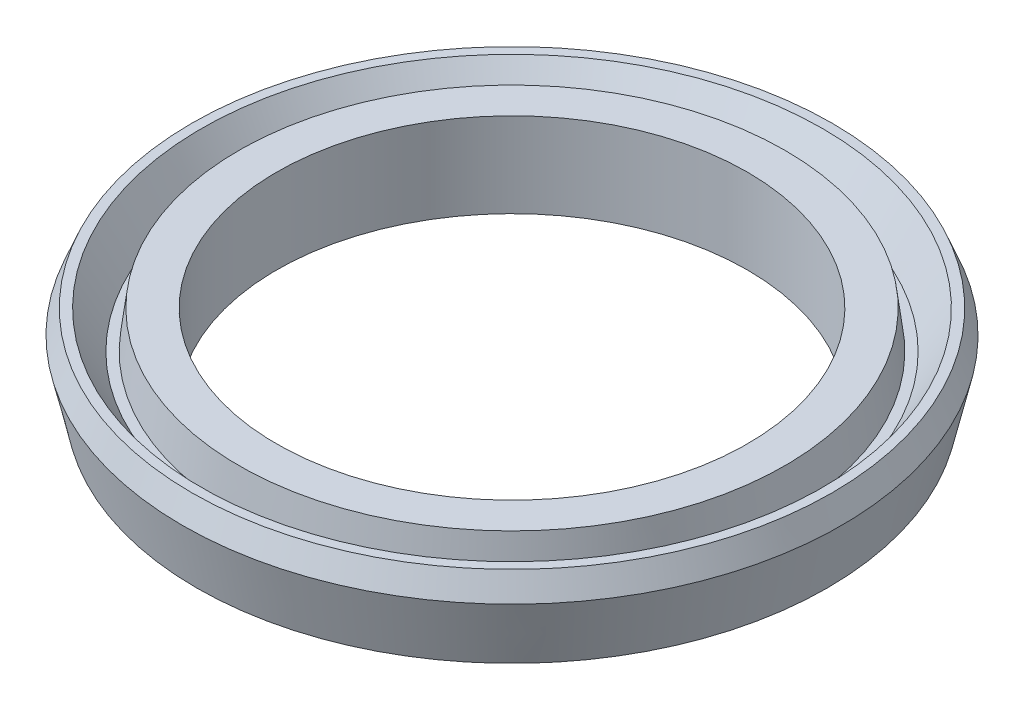
ISO-10303-21;
HEADER;
FILE_DESCRIPTION(('STEP AP214'),'2;1');
FILE_NAME('part.step','',(''),(''),'','','');
FILE_SCHEMA(('AUTOMOTIVE_DESIGN { 1 0 10303 214 1 1 1 1 }'));
ENDSEC;
DATA;
#1=APPLICATION_CONTEXT('core data for automotive mechanical design processes');
#2=APPLICATION_PROTOCOL_DEFINITION('international standard','automotive_design',2000,#1);
#3=PRODUCT_CONTEXT('',#1,'mechanical');
#4=PRODUCT('Part','Part','',(#3));
#5=PRODUCT_RELATED_PRODUCT_CATEGORY('part','',(#4));
#6=PRODUCT_DEFINITION_FORMATION('','',#4);
#7=PRODUCT_DEFINITION_CONTEXT('part definition',#1,'design');
#8=PRODUCT_DEFINITION('design','',#6,#7);
#9=PRODUCT_DEFINITION_SHAPE('','',#8);
#10=(LENGTH_UNIT() NAMED_UNIT(*) SI_UNIT(.MILLI.,.METRE.));
#11=(NAMED_UNIT(*) PLANE_ANGLE_UNIT() SI_UNIT($,.RADIAN.));
#12=(NAMED_UNIT(*) SI_UNIT($,.STERADIAN.) SOLID_ANGLE_UNIT());
#13=UNCERTAINTY_MEASURE_WITH_UNIT(LENGTH_MEASURE(1.E-05),#10,'distance_accuracy_value','');
#14=(GEOMETRIC_REPRESENTATION_CONTEXT(3) GLOBAL_UNCERTAINTY_ASSIGNED_CONTEXT((#13)) GLOBAL_UNIT_ASSIGNED_CONTEXT((#10,
#11,#12)) REPRESENTATION_CONTEXT('',''));
#15=CARTESIAN_POINT('',(0.,0.,0.));
#16=DIRECTION('',(0.,0.,1.));
#17=DIRECTION('',(1.,0.,0.));
#18=AXIS2_PLACEMENT_3D('',#15,#16,#17);
#19=CARTESIAN_POINT('',(6.7,0.,0.));
#20=DIRECTION('',(0.,-1.,0.));
#21=DIRECTION('',(0.,0.,-1.));
#22=AXIS2_PLACEMENT_3D('',#19,#20,#21);
#23=PLANE('',#22);
#24=CARTESIAN_POINT('',(0.,0.,0.));
#25=DIRECTION('',(0.,-1.,0.));
#26=DIRECTION('',(0.,0.,-1.));
#27=AXIS2_PLACEMENT_3D('',#24,#25,#26);
#28=CIRCLE('',#27,6.7);
#29=CARTESIAN_POINT('',(0.,0.,-6.7));
#30=VERTEX_POINT('',#29);
#31=EDGE_CURVE('E63',#30,#30,#28,.T.);
#32=ORIENTED_EDGE('',*,*,#31,.T.);
#33=EDGE_LOOP('',(#32));
#34=FACE_BOUND('',#33,.T.);
#35=CARTESIAN_POINT('',(0.,0.,0.));
#36=DIRECTION('',(0.,-1.,0.));
#37=DIRECTION('',(0.,0.,-1.));
#38=AXIS2_PLACEMENT_3D('',#35,#36,#37);
#39=CIRCLE('',#38,5.);
#40=CARTESIAN_POINT('',(0.,0.,-5.));
#41=VERTEX_POINT('',#40);
#42=EDGE_CURVE('E10',#41,#41,#39,.T.);
#43=ORIENTED_EDGE('',*,*,#42,.F.);
#44=EDGE_LOOP('',(#43));
#45=FACE_BOUND('',#44,.T.);
#46=ADVANCED_FACE('F32',(#34,#45),#23,.T.);
#47=CARTESIAN_POINT('',(0.,0.,0.));
#48=DIRECTION('',(0.,-1.,0.));
#49=DIRECTION('',(0.,0.,-1.));
#50=AXIS2_PLACEMENT_3D('',#47,#48,#49);
#51=CYLINDRICAL_SURFACE('',#50,5.);
#52=ORIENTED_EDGE('',*,*,#42,.T.);
#53=EDGE_LOOP('',(#52));
#54=FACE_BOUND('',#53,.T.);
#55=CARTESIAN_POINT('',(0.,1.8,0.));
#56=DIRECTION('',(0.,-1.,0.));
#57=DIRECTION('',(0.,0.,-1.));
#58=AXIS2_PLACEMENT_3D('',#55,#56,#57);
#59=CIRCLE('',#58,5.);
#60=CARTESIAN_POINT('',(0.,1.8,-5.));
#61=VERTEX_POINT('',#60);
#62=EDGE_CURVE('E38',#61,#61,#59,.T.);
#63=ORIENTED_EDGE('',*,*,#62,.F.);
#64=EDGE_LOOP('',(#63));
#65=FACE_BOUND('',#64,.T.);
#66=ADVANCED_FACE('F81',(#54,#65),#51,.F.);
#67=CARTESIAN_POINT('',(5.,1.8,0.));
#68=DIRECTION('',(0.,1.,0.));
#69=DIRECTION('',(0.,0.,1.));
#70=AXIS2_PLACEMENT_3D('',#67,#68,#69);
#71=PLANE('',#70);
#72=ORIENTED_EDGE('',*,*,#62,.T.);
#73=EDGE_LOOP('',(#72));
#74=FACE_BOUND('',#73,.T.);
#75=CARTESIAN_POINT('',(0.,1.8,0.));
#76=DIRECTION('',(0.,-1.,0.));
#77=DIRECTION('',(0.,0.,-1.));
#78=AXIS2_PLACEMENT_3D('',#75,#76,#77);
#79=CIRCLE('',#78,5.8);
#80=CARTESIAN_POINT('',(0.,1.8,-5.8));
#81=VERTEX_POINT('',#80);
#82=EDGE_CURVE('E42',#81,#81,#79,.T.);
#83=ORIENTED_EDGE('',*,*,#82,.F.);
#84=EDGE_LOOP('',(#83));
#85=FACE_BOUND('',#84,.T.);
#86=ADVANCED_FACE('F85',(#74,#85),#71,.T.);
#87=CARTESIAN_POINT('',(0.,1.,0.));
#88=DIRECTION('',(0.,-1.,0.));
#89=DIRECTION('',(0.,0.,-1.));
#90=AXIS2_PLACEMENT_3D('',#87,#88,#89);
#91=CONICAL_SURFACE('',#90,5.9,0.124354994546762);
#92=ORIENTED_EDGE('',*,*,#82,.T.);
#93=EDGE_LOOP('',(#92));
#94=FACE_BOUND('',#93,.T.);
#95=CARTESIAN_POINT('',(0.,1.,0.));
#96=DIRECTION('',(0.,-1.,0.));
#97=DIRECTION('',(0.,0.,-1.));
#98=AXIS2_PLACEMENT_3D('',#95,#96,#97);
#99=CIRCLE('',#98,5.9);
#100=CARTESIAN_POINT('',(0.,1.,-5.9));
#101=VERTEX_POINT('',#100);
#102=EDGE_CURVE('E46',#101,#101,#99,.T.);
#103=ORIENTED_EDGE('',*,*,#102,.F.);
#104=EDGE_LOOP('',(#103));
#105=FACE_BOUND('',#104,.T.);
#106=ADVANCED_FACE('F89',(#94,#105),#91,.T.);
#107=CARTESIAN_POINT('',(5.9,1.,0.));
#108=DIRECTION('',(0.,1.,0.));
#109=DIRECTION('',(0.,0.,1.));
#110=AXIS2_PLACEMENT_3D('',#107,#108,#109);
#111=PLANE('',#110);
#112=ORIENTED_EDGE('',*,*,#102,.T.);
#113=EDGE_LOOP('',(#112));
#114=FACE_BOUND('',#113,.T.);
#115=CARTESIAN_POINT('',(0.,0.999999999999999,0.));
#116=DIRECTION('',(0.,-1.,0.));
#117=DIRECTION('',(0.,0.,-1.));
#118=AXIS2_PLACEMENT_3D('',#115,#116,#117);
#119=CIRCLE('',#118,6.1);
#120=CARTESIAN_POINT('',(0.,0.999999999999999,-6.1));
#121=VERTEX_POINT('',#120);
#122=EDGE_CURVE('E51',#121,#121,#119,.T.);
#123=ORIENTED_EDGE('',*,*,#122,.F.);
#124=EDGE_LOOP('',(#123));
#125=FACE_BOUND('',#124,.T.);
#126=ADVANCED_FACE('F95',(#114,#125),#111,.T.);
#127=CARTESIAN_POINT('',(0.,1.8,0.));
#128=DIRECTION('',(0.,1.,0.));
#129=DIRECTION('',(0.,0.,1.));
#130=AXIS2_PLACEMENT_3D('',#127,#128,#129);
#131=CONICAL_SURFACE('',#130,6.6,0.558599315343562);
#132=ORIENTED_EDGE('',*,*,#122,.T.);
#133=EDGE_LOOP('',(#132));
#134=FACE_BOUND('',#133,.T.);
#135=CARTESIAN_POINT('',(0.,1.8,0.));
#136=DIRECTION('',(0.,-1.,0.));
#137=DIRECTION('',(0.,0.,-1.));
#138=AXIS2_PLACEMENT_3D('',#135,#136,#137);
#139=CIRCLE('',#138,6.6);
#140=CARTESIAN_POINT('',(0.,1.8,-6.6));
#141=VERTEX_POINT('',#140);
#142=EDGE_CURVE('E54',#141,#141,#139,.T.);
#143=ORIENTED_EDGE('',*,*,#142,.F.);
#144=EDGE_LOOP('',(#143));
#145=FACE_BOUND('',#144,.T.);
#146=ADVANCED_FACE('F99',(#134,#145),#131,.F.);
#147=CARTESIAN_POINT('',(6.6,1.8,0.));
#148=DIRECTION('',(0.,1.,0.));
#149=DIRECTION('',(0.,0.,1.));
#150=AXIS2_PLACEMENT_3D('',#147,#148,#149);
#151=PLANE('',#150);
#152=ORIENTED_EDGE('',*,*,#142,.T.);
#153=EDGE_LOOP('',(#152));
#154=FACE_BOUND('',#153,.T.);
#155=CARTESIAN_POINT('',(0.,1.8,0.));
#156=DIRECTION('',(0.,-1.,0.));
#157=DIRECTION('',(0.,0.,-1.));
#158=AXIS2_PLACEMENT_3D('',#155,#156,#157);
#159=CIRCLE('',#158,6.8);
#160=CARTESIAN_POINT('',(0.,1.8,-6.8));
#161=VERTEX_POINT('',#160);
#162=EDGE_CURVE('E57',#161,#161,#159,.T.);
#163=ORIENTED_EDGE('',*,*,#162,.F.);
#164=EDGE_LOOP('',(#163));
#165=FACE_BOUND('',#164,.T.);
#166=ADVANCED_FACE('F77',(#154,#165),#151,.T.);
#167=CARTESIAN_POINT('',(0.,1.3,0.));
#168=DIRECTION('',(0.,-1.,0.));
#169=DIRECTION('',(0.,0.,-1.));
#170=AXIS2_PLACEMENT_3D('',#167,#168,#169);
#171=CONICAL_SURFACE('',#170,7.,0.380506377112361);
#172=ORIENTED_EDGE('',*,*,#162,.T.);
#173=EDGE_LOOP('',(#172));
#174=FACE_BOUND('',#173,.T.);
#175=CARTESIAN_POINT('',(0.,1.3,0.));
#176=DIRECTION('',(0.,-1.,0.));
#177=DIRECTION('',(0.,0.,-1.));
#178=AXIS2_PLACEMENT_3D('',#175,#176,#177);
#179=CIRCLE('',#178,7.);
#180=CARTESIAN_POINT('',(0.,1.3,-7.));
#181=VERTEX_POINT('',#180);
#182=EDGE_CURVE('E60',#181,#181,#179,.T.);
#183=ORIENTED_EDGE('',*,*,#182,.F.);
#184=EDGE_LOOP('',(#183));
#185=FACE_BOUND('',#184,.T.);
#186=ADVANCED_FACE('F71',(#174,#185),#171,.T.);
#187=CARTESIAN_POINT('',(0.,0.,0.));
#188=DIRECTION('',(0.,1.,0.));
#189=DIRECTION('',(0.,0.,1.));
#190=AXIS2_PLACEMENT_3D('',#187,#188,#189);
#191=CONICAL_SURFACE('',#190,6.7,0.226798848053886);
#192=ORIENTED_EDGE('',*,*,#182,.T.);
#193=EDGE_LOOP('',(#192));
#194=FACE_BOUND('',#193,.T.);
#195=ORIENTED_EDGE('',*,*,#31,.F.);
#196=EDGE_LOOP('',(#195));
#197=FACE_BOUND('',#196,.T.);
#198=ADVANCED_FACE('F69',(#194,#197),#191,.T.);
#199=CLOSED_SHELL('',(#46,#66,#86,#106,#126,#146,#166,#186,#198));
#200=MANIFOLD_SOLID_BREP('B2',#199);
#201=ADVANCED_BREP_SHAPE_REPRESENTATION('',(#18,#200),#14);
#202=SHAPE_DEFINITION_REPRESENTATION(#9,#201);
ENDSEC;
END-ISO-10303-21;
